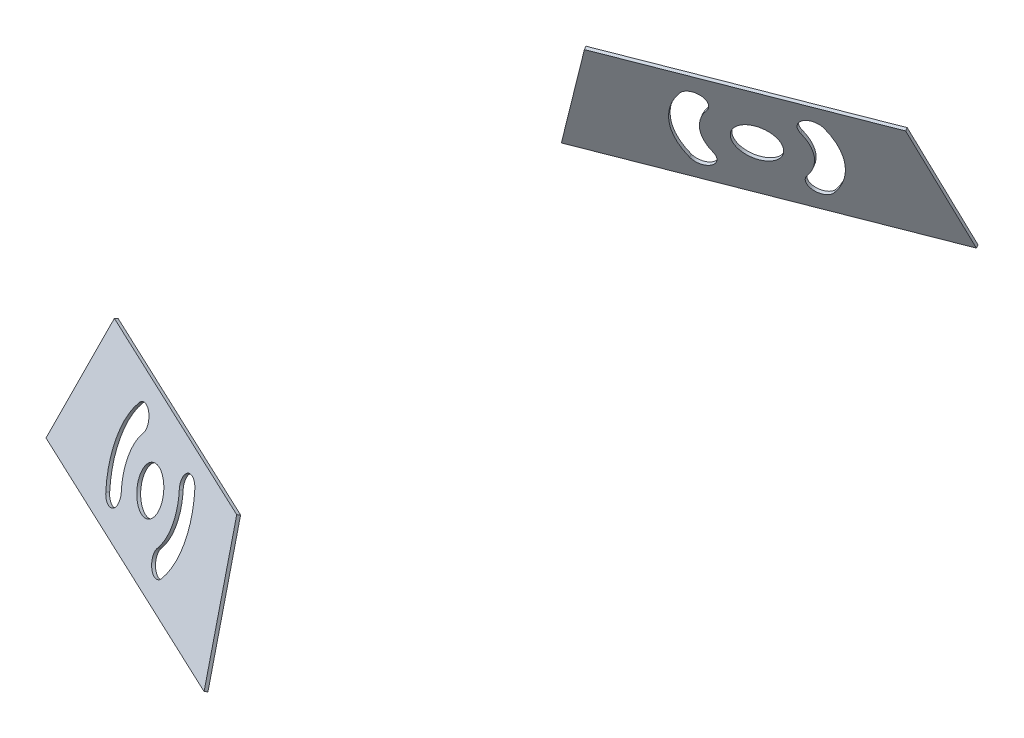
ISO-10303-21;
HEADER;
FILE_DESCRIPTION(('STEP AP214'),'2;1');
FILE_NAME('part.step','',(''),(''),'','','');
FILE_SCHEMA(('AUTOMOTIVE_DESIGN { 1 0 10303 214 1 1 1 1 }'));
ENDSEC;
DATA;
#1=APPLICATION_CONTEXT('core data for automotive mechanical design processes');
#2=APPLICATION_PROTOCOL_DEFINITION('international standard','automotive_design',2000,#1);
#3=PRODUCT_CONTEXT('',#1,'mechanical');
#4=PRODUCT('Part','Part','',(#3));
#5=PRODUCT_RELATED_PRODUCT_CATEGORY('part','',(#4));
#6=PRODUCT_DEFINITION_FORMATION('','',#4);
#7=PRODUCT_DEFINITION_CONTEXT('part definition',#1,'design');
#8=PRODUCT_DEFINITION('design','',#6,#7);
#9=PRODUCT_DEFINITION_SHAPE('','',#8);
#10=(LENGTH_UNIT() NAMED_UNIT(*) SI_UNIT(.MILLI.,.METRE.));
#11=(NAMED_UNIT(*) PLANE_ANGLE_UNIT() SI_UNIT($,.RADIAN.));
#12=(NAMED_UNIT(*) SI_UNIT($,.STERADIAN.) SOLID_ANGLE_UNIT());
#13=UNCERTAINTY_MEASURE_WITH_UNIT(LENGTH_MEASURE(1.E-05),#10,'distance_accuracy_value','');
#14=(GEOMETRIC_REPRESENTATION_CONTEXT(3) GLOBAL_UNCERTAINTY_ASSIGNED_CONTEXT((#13)) GLOBAL_UNIT_ASSIGNED_CONTEXT((#10,
#11,#12)) REPRESENTATION_CONTEXT('',''));
#15=CARTESIAN_POINT('',(0.,0.,0.));
#16=DIRECTION('',(0.,0.,1.));
#17=DIRECTION('',(1.,0.,0.));
#18=AXIS2_PLACEMENT_3D('',#15,#16,#17);
#19=CARTESIAN_POINT('',(-100.488337980226,792.240755520623,249.167094537771));
#20=DIRECTION('',(0.914828301064966,0.27717018179206,0.293710520574162));
#21=DIRECTION('',(-0.30568708311749,0.,0.95213203244882));
#22=AXIS2_PLACEMENT_3D('',#19,#20,#21);
#23=PLANE('',#22);
#24=DIRECTION('',(-0.14672213102117,0.905707057420315,-0.397702580338172));
#25=VECTOR('',#24,1.);
#26=CARTESIAN_POINT('',(-99.7358440045978,791.599284035787,247.42862764111));
#27=LINE('',#26,#25);
#28=CARTESIAN_POINT('',(-99.7358440045978,791.599284035787,247.42862764111));
#29=VERTEX_POINT('',#28);
#30=CARTESIAN_POINT('',(-112.02246548364,867.443873450963,214.124714783217));
#31=VERTEX_POINT('',#30);
#32=EDGE_CURVE('E209',#29,#31,#27,.T.);
#33=ORIENTED_EDGE('',*,*,#32,.T.);
#34=DIRECTION('',(0.376246987814116,-0.320735742417944,-0.869233448330433));
#35=VECTOR('',#34,1.);
#36=CARTESIAN_POINT('',(-112.774959459268,868.085344935799,215.863181679878));
#37=LINE('',#36,#35);
#38=CARTESIAN_POINT('',(-112.774959459268,868.085344935799,215.863181679878));
#39=VERTEX_POINT('',#38);
#40=EDGE_CURVE('E227',#39,#31,#37,.T.);
#41=ORIENTED_EDGE('',*,*,#40,.F.);
#42=DIRECTION('',(-0.14672213102117,0.905707057420315,-0.397702580338172));
#43=VECTOR('',#42,1.);
#44=CARTESIAN_POINT('',(-100.488337980226,792.240755520623,249.167094537771));
#45=LINE('',#44,#43);
#46=CARTESIAN_POINT('',(-100.488337980226,792.240755520623,249.167094537771));
#47=VERTEX_POINT('',#46);
#48=EDGE_CURVE('E213',#47,#39,#45,.T.);
#49=ORIENTED_EDGE('',*,*,#48,.F.);
#50=DIRECTION('',(0.376246987814116,-0.320735742417944,-0.869233448330433));
#51=VECTOR('',#50,1.);
#52=CARTESIAN_POINT('',(-100.488337980226,792.240755520623,249.167094537771));
#53=LINE('',#52,#51);
#54=EDGE_CURVE('E239',#47,#29,#53,.T.);
#55=ORIENTED_EDGE('',*,*,#54,.T.);
#56=EDGE_LOOP('',(#33,#41,#49,#55));
#57=FACE_BOUND('',#56,.T.);
#58=ADVANCED_FACE('F48',(#57),#23,.T.);
#59=CARTESIAN_POINT('',(-285.026253943677,800.018088417502,166.420274569434));
#60=DIRECTION('',(-0.164534605967378,-0.94638888204511,0.27798641582021));
#61=DIRECTION('',(0.,0.281827353128359,0.959465133826479));
#62=AXIS2_PLACEMENT_3D('',#59,#60,#61);
#63=PLANE('',#62);
#64=DIRECTION('',(0.911793050861852,-0.0384274313091164,0.408848095168632));
#65=VECTOR('',#64,1.);
#66=CARTESIAN_POINT('',(-284.273759968049,799.376616932666,164.681807672773));
#67=LINE('',#66,#65);
#68=CARTESIAN_POINT('',(-284.273759968049,799.376616932666,164.681807672773));
#69=VERTEX_POINT('',#68);
#70=EDGE_CURVE('E218',#69,#29,#67,.T.);
#71=ORIENTED_EDGE('',*,*,#70,.T.);
#72=ORIENTED_EDGE('',*,*,#54,.F.);
#73=DIRECTION('',(0.911793050861852,-0.0384274313091164,0.408848095168632));
#74=VECTOR('',#73,1.);
#75=CARTESIAN_POINT('',(-285.026253943677,800.018088417502,166.420274569434));
#76=LINE('',#75,#74);
#77=CARTESIAN_POINT('',(-285.026253943677,800.018088417502,166.420274569434));
#78=VERTEX_POINT('',#77);
#79=EDGE_CURVE('E224',#78,#47,#76,.T.);
#80=ORIENTED_EDGE('',*,*,#79,.F.);
#81=DIRECTION('',(0.376246987814116,-0.320735742417944,-0.869233448330433));
#82=VECTOR('',#81,1.);
#83=CARTESIAN_POINT('',(-285.026253943677,800.018088417502,166.420274569434));
#84=LINE('',#83,#82);
#85=EDGE_CURVE('E244',#78,#69,#84,.T.);
#86=ORIENTED_EDGE('',*,*,#85,.T.);
#87=EDGE_LOOP('',(#71,#72,#80,#86));
#88=FACE_BOUND('',#87,.T.);
#89=ADVANCED_FACE('F297',(#88),#63,.T.);
#90=CARTESIAN_POINT('',(-255.598601468505,874.104633728837,151.821046323257));
#91=DIRECTION('',(-0.852401095250554,0.247851463681334,-0.460415057059038));
#92=DIRECTION('',(0.475243586056191,0.,-0.879854268565228));
#93=AXIS2_PLACEMENT_3D('',#90,#91,#92);
#94=PLANE('',#93);
#95=DIRECTION('',(-0.363112347595701,-0.914165321748003,0.180142131487634));
#96=VECTOR('',#95,1.);
#97=CARTESIAN_POINT('',(-254.846107492877,873.463162244002,150.082579426596));
#98=LINE('',#97,#96);
#99=CARTESIAN_POINT('',(-254.846107492877,873.463162244002,150.082579426596));
#100=VERTEX_POINT('',#99);
#101=EDGE_CURVE('E234',#100,#69,#98,.T.);
#102=ORIENTED_EDGE('',*,*,#101,.T.);
#103=ORIENTED_EDGE('',*,*,#85,.F.);
#104=DIRECTION('',(-0.363112347595701,-0.914165321748003,0.180142131487634));
#105=VECTOR('',#104,1.);
#106=CARTESIAN_POINT('',(-255.598601468505,874.104633728837,151.821046323257));
#107=LINE('',#106,#105);
#108=CARTESIAN_POINT('',(-255.598601468505,874.104633728837,151.821046323257));
#109=VERTEX_POINT('',#108);
#110=EDGE_CURVE('E221',#109,#78,#107,.T.);
#111=ORIENTED_EDGE('',*,*,#110,.F.);
#112=DIRECTION('',(0.376246987814116,-0.320735742417944,-0.869233448330433));
#113=VECTOR('',#112,1.);
#114=CARTESIAN_POINT('',(-255.598601468505,874.104633728837,151.821046323257));
#115=LINE('',#114,#113);
#116=EDGE_CURVE('E248',#109,#100,#115,.T.);
#117=ORIENTED_EDGE('',*,*,#116,.T.);
#118=EDGE_LOOP('',(#102,#103,#111,#117));
#119=FACE_BOUND('',#118,.T.);
#120=ADVANCED_FACE('F302',(#119),#94,.T.);
#121=CARTESIAN_POINT('',(-112.774959459268,868.085344935799,215.863181679878));
#122=DIRECTION('',(0.164534605967344,0.946388882045112,-0.277986415820225));
#123=DIRECTION('',(0.,-0.281827353128373,-0.959465133826475));
#124=AXIS2_PLACEMENT_3D('',#121,#122,#123);
#125=PLANE('',#124);
#126=DIRECTION('',(-0.911793050861858,0.0384274313090818,-0.408848095168622));
#127=VECTOR('',#126,1.);
#128=CARTESIAN_POINT('',(-112.02246548364,867.443873450963,214.124714783217));
#129=LINE('',#128,#127);
#130=EDGE_CURVE('E231',#31,#100,#129,.T.);
#131=ORIENTED_EDGE('',*,*,#130,.T.);
#132=ORIENTED_EDGE('',*,*,#116,.F.);
#133=DIRECTION('',(-0.911793050861858,0.0384274313090818,-0.408848095168622));
#134=VECTOR('',#133,1.);
#135=CARTESIAN_POINT('',(-112.774959459268,868.085344935799,215.863181679878));
#136=LINE('',#135,#134);
#137=EDGE_CURVE('E217',#39,#109,#136,.T.);
#138=ORIENTED_EDGE('',*,*,#137,.F.);
#139=ORIENTED_EDGE('',*,*,#40,.T.);
#140=EDGE_LOOP('',(#131,#132,#138,#139));
#141=FACE_BOUND('',#140,.T.);
#142=ADVANCED_FACE('F314',(#141),#125,.T.);
#143=CARTESIAN_POINT('',(-191.318859555588,163.09179460709,441.998892770698));
#144=DIRECTION('',(0.376246987814115,-0.320735742417945,-0.869233448330432));
#145=DIRECTION('',(0.917717646573411,0.,0.397233333404637));
#146=AXIS2_PLACEMENT_3D('',#143,#144,#145);
#147=PLANE('',#146);
#148=CARTESIAN_POINT('',(-188.472038212911,833.612205650694,195.817899277588));
#149=DIRECTION('',(0.376246987814116,-0.320735742417944,-0.869233448330433));
#150=DIRECTION('',(-0.917717646573411,0.,-0.397233333404637));
#151=AXIS2_PLACEMENT_3D('',#148,#149,#150);
#152=CIRCLE('',#151,42.9999999999843);
#153=CARTESIAN_POINT('',(-152.502164163958,856.013638420316,203.121594970125));
#154=VERTEX_POINT('',#153);
#155=CARTESIAN_POINT('',(-160.073134703262,809.311043668525,217.077151516664));
#156=VERTEX_POINT('',#155);
#157=EDGE_CURVE('E143',#154,#156,#152,.T.);
#158=ORIENTED_EDGE('',*,*,#157,.T.);
#159=CARTESIAN_POINT('',(-165.02643182704,813.549618432857,213.369142405197));
#160=DIRECTION('',(0.376246987814116,-0.320735742417944,-0.869233448330433));
#161=DIRECTION('',(-0.917717646573411,0.,-0.397233333404637));
#162=AXIS2_PLACEMENT_3D('',#159,#160,#161);
#163=CIRCLE('',#162,7.50000000000004);
#164=CARTESIAN_POINT('',(-169.979728950819,817.788193197189,209.661133293729));
#165=VERTEX_POINT('',#164);
#166=EDGE_CURVE('E153',#156,#165,#163,.T.);
#167=ORIENTED_EDGE('',*,*,#166,.T.);
#168=CARTESIAN_POINT('',(-188.472038212911,833.612205650694,195.817899277588));
#169=DIRECTION('',(-0.376246987814116,0.320735742417944,0.869233448330433));
#170=DIRECTION('',(-0.917717646573411,0.,-0.397233333404637));
#171=AXIS2_PLACEMENT_3D('',#168,#169,#170);
#172=CIRCLE('',#171,27.9999999999841);
#173=CARTESIAN_POINT('',(-165.049794646156,848.199185128585,200.573794147147));
#174=VERTEX_POINT('',#173);
#175=EDGE_CURVE('E159',#165,#174,#172,.T.);
#176=ORIENTED_EDGE('',*,*,#175,.T.);
#177=CARTESIAN_POINT('',(-158.775979405059,852.10641177445,201.847694558636));
#178=DIRECTION('',(0.376246987814116,-0.320735742417944,-0.869233448330433));
#179=DIRECTION('',(-0.917717646573411,0.,-0.397233333404637));
#180=AXIS2_PLACEMENT_3D('',#177,#178,#179);
#181=CIRCLE('',#180,7.5000000000001);
#182=EDGE_CURVE('E163',#174,#154,#181,.T.);
#183=ORIENTED_EDGE('',*,*,#182,.T.);
#184=EDGE_LOOP('',(#158,#167,#176,#183));
#185=FACE_BOUND('',#184,.T.);
#186=CARTESIAN_POINT('',(-188.472038212911,833.612205650694,195.817899277588));
#187=DIRECTION('',(0.376246987814116,-0.320735742417944,-0.869233448330433));
#188=DIRECTION('',(-0.917717646573411,0.,-0.397233333404637));
#189=AXIS2_PLACEMENT_3D('',#186,#187,#188);
#190=CIRCLE('',#189,42.9999999999991);
#191=CARTESIAN_POINT('',(-224.441912261877,811.210772881066,188.514203585045));
#192=VERTEX_POINT('',#191);
#193=CARTESIAN_POINT('',(-216.870941722575,857.913367632866,174.558647038504));
#194=VERTEX_POINT('',#193);
#195=EDGE_CURVE('E185',#192,#194,#190,.T.);
#196=ORIENTED_EDGE('',*,*,#195,.T.);
#197=CARTESIAN_POINT('',(-211.917644598797,853.674792868535,178.266656149972));
#198=DIRECTION('',(0.376246987814116,-0.320735742417944,-0.869233448330433));
#199=DIRECTION('',(-0.917717646573411,0.,-0.397233333404637));
#200=AXIS2_PLACEMENT_3D('',#197,#198,#199);
#201=CIRCLE('',#200,7.49999999999986);
#202=CARTESIAN_POINT('',(-206.964347475019,849.436218104202,181.97466526144));
#203=VERTEX_POINT('',#202);
#204=EDGE_CURVE('E189',#194,#203,#201,.T.);
#205=ORIENTED_EDGE('',*,*,#204,.T.);
#206=CARTESIAN_POINT('',(-188.472038212911,833.612205650694,195.817899277588));
#207=DIRECTION('',(-0.376246987814116,0.320735742417944,0.869233448330433));
#208=DIRECTION('',(-0.917717646573411,0.,-0.397233333404637));
#209=AXIS2_PLACEMENT_3D('',#206,#207,#208);
#210=CIRCLE('',#209,27.9999999999994);
#211=CARTESIAN_POINT('',(-211.894281779681,819.025226172798,191.062004408025));
#212=VERTEX_POINT('',#211);
#213=EDGE_CURVE('E192',#203,#212,#210,.T.);
#214=ORIENTED_EDGE('',*,*,#213,.T.);
#215=CARTESIAN_POINT('',(-218.16809702078,815.117999526931,189.788103996536));
#216=DIRECTION('',(0.376246987814116,-0.320735742417944,-0.869233448330433));
#217=DIRECTION('',(-0.917717646573411,0.,-0.397233333404637));
#218=AXIS2_PLACEMENT_3D('',#215,#216,#217);
#219=CIRCLE('',#218,7.4999999999999);
#220=EDGE_CURVE('E182',#212,#192,#219,.T.);
#221=ORIENTED_EDGE('',*,*,#220,.T.);
#222=EDGE_LOOP('',(#196,#205,#214,#221));
#223=FACE_BOUND('',#222,.T.);
#224=CARTESIAN_POINT('',(-188.472038212919,833.612205650692,195.817899277584));
#225=DIRECTION('',(-0.376246987814116,0.320735742417944,0.869233448330433));
#226=DIRECTION('',(0.917717646573411,0.,0.397233333404637));
#227=AXIS2_PLACEMENT_3D('',#224,#225,#226);
#228=CIRCLE('',#227,12.9999999999907);
#229=CARTESIAN_POINT('',(-176.541708807473,833.612205650692,200.981932611841));
#230=VERTEX_POINT('',#229);
#231=EDGE_CURVE('E206',#230,#230,#228,.T.);
#232=ORIENTED_EDGE('',*,*,#231,.F.);
#233=EDGE_LOOP('',(#232));
#234=FACE_BOUND('',#233,.T.);
#235=ORIENTED_EDGE('',*,*,#48,.T.);
#236=ORIENTED_EDGE('',*,*,#137,.T.);
#237=ORIENTED_EDGE('',*,*,#110,.T.);
#238=ORIENTED_EDGE('',*,*,#79,.T.);
#239=EDGE_LOOP('',(#235,#236,#237,#238));
#240=FACE_BOUND('',#239,.T.);
#241=ADVANCED_FACE('F161',(#185,#223,#234,#240),#147,.F.);
#242=CARTESIAN_POINT('',(-190.56636557996,162.450323122254,440.260425874037));
#243=DIRECTION('',(0.376246987814115,-0.320735742417945,-0.869233448330432));
#244=DIRECTION('',(0.917717646573411,0.,0.397233333404637));
#245=AXIS2_PLACEMENT_3D('',#242,#243,#244);
#246=PLANE('',#245);
#247=CARTESIAN_POINT('',(-158.02348542943,851.464940289614,200.109227661974));
#248=DIRECTION('',(-0.376246987814115,0.320735742417945,0.869233448330432));
#249=DIRECTION('',(0.917717646573411,0.,0.397233333404637));
#250=AXIS2_PLACEMENT_3D('',#247,#248,#249);
#251=CIRCLE('',#250,7.5000000000001);
#252=CARTESIAN_POINT('',(-151.74967018833,855.37216693548,201.383128073465));
#253=VERTEX_POINT('',#252);
#254=CARTESIAN_POINT('',(-164.297300670527,847.557713643749,198.835327250485));
#255=VERTEX_POINT('',#254);
#256=EDGE_CURVE('E12',#253,#255,#251,.T.);
#257=ORIENTED_EDGE('',*,*,#256,.T.);
#258=CARTESIAN_POINT('',(-187.719544237283,832.970734165858,194.079432380926));
#259=DIRECTION('',(-0.376246987814115,0.320735742417945,0.869233448330432));
#260=DIRECTION('',(0.917717646573411,0.,0.397233333404637));
#261=AXIS2_PLACEMENT_3D('',#258,#259,#260);
#262=CIRCLE('',#261,27.9999999999841);
#263=CARTESIAN_POINT('',(-169.22723497519,817.146721712353,207.922666397067));
#264=VERTEX_POINT('',#263);
#265=EDGE_CURVE('E56',#255,#264,#262,.F.);
#266=ORIENTED_EDGE('',*,*,#265,.T.);
#267=CARTESIAN_POINT('',(-164.273937851411,812.908146948021,211.630675508535));
#268=DIRECTION('',(-0.376246987814115,0.320735742417945,0.869233448330432));
#269=DIRECTION('',(0.917717646573411,0.,0.397233333404637));
#270=AXIS2_PLACEMENT_3D('',#267,#268,#269);
#271=CIRCLE('',#270,7.50000000000004);
#272=CARTESIAN_POINT('',(-159.320640727634,808.669572183689,215.338684620002));
#273=VERTEX_POINT('',#272);
#274=EDGE_CURVE('E272',#264,#273,#271,.T.);
#275=ORIENTED_EDGE('',*,*,#274,.T.);
#276=CARTESIAN_POINT('',(-187.719544237283,832.970734165858,194.079432380926));
#277=DIRECTION('',(-0.376246987814115,0.320735742417945,0.869233448330432));
#278=DIRECTION('',(0.917717646573411,0.,0.397233333404637));
#279=AXIS2_PLACEMENT_3D('',#276,#277,#278);
#280=CIRCLE('',#279,42.9999999999843);
#281=EDGE_CURVE('E145',#273,#253,#280,.T.);
#282=ORIENTED_EDGE('',*,*,#281,.T.);
#283=EDGE_LOOP('',(#257,#266,#275,#282));
#284=FACE_BOUND('',#283,.T.);
#285=CARTESIAN_POINT('',(-217.415603045151,814.476528042095,188.049637099874));
#286=DIRECTION('',(-0.376246987814115,0.320735742417945,0.869233448330432));
#287=DIRECTION('',(0.917717646573411,0.,0.397233333404637));
#288=AXIS2_PLACEMENT_3D('',#285,#286,#287);
#289=CIRCLE('',#288,7.4999999999999);
#290=CARTESIAN_POINT('',(-223.689418286249,810.56930139623,186.775736688384));
#291=VERTEX_POINT('',#290);
#292=CARTESIAN_POINT('',(-211.141787804052,818.383754687962,189.323537511363));
#293=VERTEX_POINT('',#292);
#294=EDGE_CURVE('E266',#291,#293,#289,.T.);
#295=ORIENTED_EDGE('',*,*,#294,.T.);
#296=CARTESIAN_POINT('',(-187.719544237283,832.970734165858,194.079432380926));
#297=DIRECTION('',(-0.376246987814115,0.320735742417945,0.869233448330432));
#298=DIRECTION('',(0.917717646573411,0.,0.397233333404637));
#299=AXIS2_PLACEMENT_3D('',#296,#297,#298);
#300=CIRCLE('',#299,27.9999999999994);
#301=CARTESIAN_POINT('',(-206.21185349939,848.794746619366,180.236198364778));
#302=VERTEX_POINT('',#301);
#303=EDGE_CURVE('E262',#293,#302,#300,.F.);
#304=ORIENTED_EDGE('',*,*,#303,.T.);
#305=CARTESIAN_POINT('',(-211.165150623169,853.033321383698,176.52818925331));
#306=DIRECTION('',(-0.376246987814115,0.320735742417945,0.869233448330432));
#307=DIRECTION('',(0.917717646573411,0.,0.397233333404637));
#308=AXIS2_PLACEMENT_3D('',#305,#306,#307);
#309=CIRCLE('',#308,7.49999999999986);
#310=CARTESIAN_POINT('',(-216.118447746946,857.27189614803,172.820180141842));
#311=VERTEX_POINT('',#310);
#312=EDGE_CURVE('E258',#302,#311,#309,.T.);
#313=ORIENTED_EDGE('',*,*,#312,.T.);
#314=CARTESIAN_POINT('',(-187.719544237283,832.970734165858,194.079432380926));
#315=DIRECTION('',(-0.376246987814115,0.320735742417945,0.869233448330432));
#316=DIRECTION('',(0.917717646573411,0.,0.397233333404637));
#317=AXIS2_PLACEMENT_3D('',#314,#315,#316);
#318=CIRCLE('',#317,42.9999999999991);
#319=EDGE_CURVE('E243',#311,#291,#318,.T.);
#320=ORIENTED_EDGE('',*,*,#319,.T.);
#321=EDGE_LOOP('',(#295,#304,#313,#320));
#322=FACE_BOUND('',#321,.T.);
#323=CARTESIAN_POINT('',(-187.71954423729,832.970734165856,194.079432380924));
#324=DIRECTION('',(-0.376246987814116,0.320735742417944,0.869233448330433));
#325=DIRECTION('',(0.917717646573411,0.,0.397233333404637));
#326=AXIS2_PLACEMENT_3D('',#323,#324,#325);
#327=CIRCLE('',#326,12.9999999999907);
#328=CARTESIAN_POINT('',(-175.789214831845,832.970734165856,199.24346571518));
#329=VERTEX_POINT('',#328);
#330=EDGE_CURVE('E177',#329,#329,#327,.T.);
#331=ORIENTED_EDGE('',*,*,#330,.T.);
#332=EDGE_LOOP('',(#331));
#333=FACE_BOUND('',#332,.T.);
#334=ORIENTED_EDGE('',*,*,#32,.F.);
#335=ORIENTED_EDGE('',*,*,#70,.F.);
#336=ORIENTED_EDGE('',*,*,#101,.F.);
#337=ORIENTED_EDGE('',*,*,#130,.F.);
#338=EDGE_LOOP('',(#334,#335,#336,#337));
#339=FACE_BOUND('',#338,.T.);
#340=ADVANCED_FACE('F278',(#284,#322,#333,#339),#246,.T.);
#341=CARTESIAN_POINT('',(-188.472038212919,833.612205650692,195.817899277584));
#342=DIRECTION('',(0.376246987814116,-0.320735742417944,-0.869233448330433));
#343=DIRECTION('',(0.917717646573411,0.,0.397233333404637));
#344=AXIS2_PLACEMENT_3D('',#341,#342,#343);
#345=CYLINDRICAL_SURFACE('',#344,12.9999999999907);
#346=ORIENTED_EDGE('',*,*,#231,.T.);
#347=EDGE_LOOP('',(#346));
#348=FACE_BOUND('',#347,.T.);
#349=ORIENTED_EDGE('',*,*,#330,.F.);
#350=EDGE_LOOP('',(#349));
#351=FACE_BOUND('',#350,.T.);
#352=ADVANCED_FACE('F328',(#348,#351),#345,.F.);
#353=CARTESIAN_POINT('',(-214.405627142638,811.910642102752,181.095769513231));
#354=DIRECTION('',(-0.376246987814116,0.320735742417944,0.869233448330433));
#355=DIRECTION('',(-0.917717646573411,0.,-0.397233333404637));
#356=AXIS2_PLACEMENT_3D('',#353,#354,#355);
#357=CYLINDRICAL_SURFACE('',#356,7.4999999999999);
#358=ORIENTED_EDGE('',*,*,#294,.F.);
#359=DIRECTION('',(-0.376246987814116,0.320735742417944,0.869233448330433));
#360=VECTOR('',#359,1.);
#361=CARTESIAN_POINT('',(-220.679442383737,808.003415456887,179.821869101741));
#362=LINE('',#361,#360);
#363=EDGE_CURVE('E71',#291,#192,#362,.T.);
#364=ORIENTED_EDGE('',*,*,#363,.T.);
#365=ORIENTED_EDGE('',*,*,#220,.F.);
#366=DIRECTION('',(-0.376246987814116,0.320735742417944,0.869233448330433));
#367=VECTOR('',#366,1.);
#368=CARTESIAN_POINT('',(-208.131811901539,815.817868748618,182.369669924721));
#369=LINE('',#368,#367);
#370=EDGE_CURVE('E169',#293,#212,#369,.T.);
#371=ORIENTED_EDGE('',*,*,#370,.F.);
#372=EDGE_LOOP('',(#358,#364,#365,#371));
#373=FACE_BOUND('',#372,.T.);
#374=ADVANCED_FACE('F333',(#373),#357,.F.);
#375=CARTESIAN_POINT('',(-184.70956833477,830.404848226515,187.125564794284));
#376=DIRECTION('',(-0.376246987814116,0.320735742417944,0.869233448330433));
#377=DIRECTION('',(-0.917717646573411,0.,-0.397233333404637));
#378=AXIS2_PLACEMENT_3D('',#375,#376,#377);
#379=CYLINDRICAL_SURFACE('',#378,27.9999999999994);
#380=ORIENTED_EDGE('',*,*,#303,.F.);
#381=ORIENTED_EDGE('',*,*,#370,.T.);
#382=ORIENTED_EDGE('',*,*,#213,.F.);
#383=DIRECTION('',(-0.376246987814116,0.320735742417944,0.869233448330433));
#384=VECTOR('',#383,1.);
#385=CARTESIAN_POINT('',(-203.201877596878,846.228860680023,173.282330778135));
#386=LINE('',#385,#384);
#387=EDGE_CURVE('E198',#302,#203,#386,.T.);
#388=ORIENTED_EDGE('',*,*,#387,.F.);
#389=EDGE_LOOP('',(#380,#381,#382,#388));
#390=FACE_BOUND('',#389,.T.);
#391=ADVANCED_FACE('F336',(#390),#379,.T.);
#392=CARTESIAN_POINT('',(-208.155174720656,850.467435444355,169.574321666667));
#393=DIRECTION('',(-0.376246987814116,0.320735742417944,0.869233448330433));
#394=DIRECTION('',(-0.917717646573411,0.,-0.397233333404637));
#395=AXIS2_PLACEMENT_3D('',#392,#393,#394);
#396=CYLINDRICAL_SURFACE('',#395,7.49999999999986);
#397=ORIENTED_EDGE('',*,*,#312,.F.);
#398=ORIENTED_EDGE('',*,*,#387,.T.);
#399=ORIENTED_EDGE('',*,*,#204,.F.);
#400=DIRECTION('',(-0.376246987814116,0.320735742417944,0.869233448330433));
#401=VECTOR('',#400,1.);
#402=CARTESIAN_POINT('',(-213.108471844434,854.706010208687,165.8663125552));
#403=LINE('',#402,#401);
#404=EDGE_CURVE('E201',#311,#194,#403,.T.);
#405=ORIENTED_EDGE('',*,*,#404,.F.);
#406=EDGE_LOOP('',(#397,#398,#399,#405));
#407=FACE_BOUND('',#406,.T.);
#408=ADVANCED_FACE('F291',(#407),#396,.F.);
#409=CARTESIAN_POINT('',(-184.70956833477,830.404848226515,187.125564794284));
#410=DIRECTION('',(-0.376246987814116,0.320735742417944,0.869233448330433));
#411=DIRECTION('',(-0.917717646573411,0.,-0.397233333404637));
#412=AXIS2_PLACEMENT_3D('',#409,#410,#411);
#413=CYLINDRICAL_SURFACE('',#412,42.9999999999991);
#414=ORIENTED_EDGE('',*,*,#319,.F.);
#415=ORIENTED_EDGE('',*,*,#404,.T.);
#416=ORIENTED_EDGE('',*,*,#195,.F.);
#417=ORIENTED_EDGE('',*,*,#363,.F.);
#418=EDGE_LOOP('',(#414,#415,#416,#417));
#419=FACE_BOUND('',#418,.T.);
#420=ADVANCED_FACE('F284',(#419),#413,.F.);
#421=CARTESIAN_POINT('',(-155.013509526917,848.89905435027,193.155360075332));
#422=DIRECTION('',(-0.376246987814116,0.320735742417944,0.869233448330433));
#423=DIRECTION('',(-0.917717646573411,0.,-0.397233333404637));
#424=AXIS2_PLACEMENT_3D('',#421,#422,#423);
#425=CYLINDRICAL_SURFACE('',#424,7.5000000000001);
#426=ORIENTED_EDGE('',*,*,#256,.F.);
#427=DIRECTION('',(-0.376246987814116,0.320735742417944,0.869233448330433));
#428=VECTOR('',#427,1.);
#429=CARTESIAN_POINT('',(-148.739694285817,852.806280996137,194.429260486822));
#430=LINE('',#429,#428);
#431=EDGE_CURVE('E63',#253,#154,#430,.T.);
#432=ORIENTED_EDGE('',*,*,#431,.T.);
#433=ORIENTED_EDGE('',*,*,#182,.F.);
#434=DIRECTION('',(-0.376246987814116,0.320735742417944,0.869233448330433));
#435=VECTOR('',#434,1.);
#436=CARTESIAN_POINT('',(-161.287324768015,844.991827704406,191.881459663842));
#437=LINE('',#436,#435);
#438=EDGE_CURVE('E174',#255,#174,#437,.T.);
#439=ORIENTED_EDGE('',*,*,#438,.F.);
#440=EDGE_LOOP('',(#426,#432,#433,#439));
#441=FACE_BOUND('',#440,.T.);
#442=ADVANCED_FACE('F282',(#441),#425,.F.);
#443=CARTESIAN_POINT('',(-184.70956833477,830.404848226515,187.125564794284));
#444=DIRECTION('',(-0.376246987814116,0.320735742417944,0.869233448330433));
#445=DIRECTION('',(-0.917717646573411,0.,-0.397233333404637));
#446=AXIS2_PLACEMENT_3D('',#443,#444,#445);
#447=CYLINDRICAL_SURFACE('',#446,27.9999999999841);
#448=ORIENTED_EDGE('',*,*,#265,.F.);
#449=ORIENTED_EDGE('',*,*,#438,.T.);
#450=ORIENTED_EDGE('',*,*,#175,.F.);
#451=DIRECTION('',(-0.376246987814116,0.320735742417944,0.869233448330433));
#452=VECTOR('',#451,1.);
#453=CARTESIAN_POINT('',(-166.217259072677,814.58083577301,200.968798810424));
#454=LINE('',#453,#452);
#455=EDGE_CURVE('E150',#264,#165,#454,.T.);
#456=ORIENTED_EDGE('',*,*,#455,.F.);
#457=EDGE_LOOP('',(#448,#449,#450,#456));
#458=FACE_BOUND('',#457,.T.);
#459=ADVANCED_FACE('F281',(#458),#447,.T.);
#460=CARTESIAN_POINT('',(-161.263961948899,810.342261008677,204.676807921892));
#461=DIRECTION('',(-0.376246987814116,0.320735742417944,0.869233448330433));
#462=DIRECTION('',(-0.917717646573411,0.,-0.397233333404637));
#463=AXIS2_PLACEMENT_3D('',#460,#461,#462);
#464=CYLINDRICAL_SURFACE('',#463,7.50000000000004);
#465=ORIENTED_EDGE('',*,*,#274,.F.);
#466=ORIENTED_EDGE('',*,*,#455,.T.);
#467=ORIENTED_EDGE('',*,*,#166,.F.);
#468=DIRECTION('',(-0.376246987814116,0.320735742417944,0.869233448330433));
#469=VECTOR('',#468,1.);
#470=CARTESIAN_POINT('',(-156.310664825121,806.103686244346,208.38481703336));
#471=LINE('',#470,#469);
#472=EDGE_CURVE('E139',#273,#156,#471,.T.);
#473=ORIENTED_EDGE('',*,*,#472,.F.);
#474=EDGE_LOOP('',(#465,#466,#467,#473));
#475=FACE_BOUND('',#474,.T.);
#476=ADVANCED_FACE('F154',(#475),#464,.F.);
#477=CARTESIAN_POINT('',(-184.70956833477,830.404848226515,187.125564794284));
#478=DIRECTION('',(-0.376246987814116,0.320735742417944,0.869233448330433));
#479=DIRECTION('',(-0.917717646573411,0.,-0.397233333404637));
#480=AXIS2_PLACEMENT_3D('',#477,#478,#479);
#481=CYLINDRICAL_SURFACE('',#480,42.9999999999843);
#482=ORIENTED_EDGE('',*,*,#281,.F.);
#483=ORIENTED_EDGE('',*,*,#472,.T.);
#484=ORIENTED_EDGE('',*,*,#157,.F.);
#485=ORIENTED_EDGE('',*,*,#431,.F.);
#486=EDGE_LOOP('',(#482,#483,#484,#485));
#487=FACE_BOUND('',#486,.T.);
#488=ADVANCED_FACE('F141',(#487),#481,.F.);
#489=CLOSED_SHELL('',(#58,#89,#120,#142,#241,#340,#352,#374,#391,#408,#420,#442,#459,#476,#488));
#490=MANIFOLD_SOLID_BREP('B2',#489);
#491=CARTESIAN_POINT('',(-100.488337980226,792.240755520623,-249.167094537771));
#492=DIRECTION('',(0.914828301064966,0.27717018179206,-0.293710520574162));
#493=DIRECTION('',(-0.30568708311749,0.,-0.95213203244882));
#494=AXIS2_PLACEMENT_3D('',#491,#492,#493);
#495=PLANE('',#494);
#496=DIRECTION('',(-0.14672213102117,0.905707057420315,0.397702580338172));
#497=VECTOR('',#496,1.);
#498=CARTESIAN_POINT('',(-99.7358440045978,791.599284035787,-247.42862764111));
#499=LINE('',#498,#497);
#500=CARTESIAN_POINT('',(-99.7358440045978,791.599284035787,-247.42862764111));
#501=VERTEX_POINT('',#500);
#502=CARTESIAN_POINT('',(-112.02246548364,867.443873450963,-214.124714783217));
#503=VERTEX_POINT('',#502);
#504=EDGE_CURVE('E618',#501,#503,#499,.T.);
#505=ORIENTED_EDGE('',*,*,#504,.F.);
#506=DIRECTION('',(0.376246987814116,-0.320735742417944,0.869233448330433));
#507=VECTOR('',#506,1.);
#508=CARTESIAN_POINT('',(-100.488337980226,792.240755520623,-249.167094537771));
#509=LINE('',#508,#507);
#510=CARTESIAN_POINT('',(-100.488337980226,792.240755520623,-249.167094537771));
#511=VERTEX_POINT('',#510);
#512=EDGE_CURVE('E653',#511,#501,#509,.T.);
#513=ORIENTED_EDGE('',*,*,#512,.F.);
#514=DIRECTION('',(-0.14672213102117,0.905707057420315,0.397702580338172));
#515=VECTOR('',#514,1.);
#516=CARTESIAN_POINT('',(-100.488337980226,792.240755520623,-249.167094537771));
#517=LINE('',#516,#515);
#518=CARTESIAN_POINT('',(-112.774959459268,868.085344935799,-215.863181679878));
#519=VERTEX_POINT('',#518);
#520=EDGE_CURVE('E621',#511,#519,#517,.T.);
#521=ORIENTED_EDGE('',*,*,#520,.T.);
#522=DIRECTION('',(0.376246987814116,-0.320735742417944,0.869233448330433));
#523=VECTOR('',#522,1.);
#524=CARTESIAN_POINT('',(-112.774959459268,868.085344935799,-215.863181679878));
#525=LINE('',#524,#523);
#526=EDGE_CURVE('E638',#519,#503,#525,.T.);
#527=ORIENTED_EDGE('',*,*,#526,.T.);
#528=EDGE_LOOP('',(#505,#513,#521,#527));
#529=FACE_BOUND('',#528,.T.);
#530=ADVANCED_FACE('F457',(#529),#495,.T.);
#531=CARTESIAN_POINT('',(-285.026253943677,800.018088417502,-166.420274569434));
#532=DIRECTION('',(-0.164534605967378,-0.94638888204511,-0.27798641582021));
#533=DIRECTION('',(0.,0.281827353128359,-0.959465133826479));
#534=AXIS2_PLACEMENT_3D('',#531,#532,#533);
#535=PLANE('',#534);
#536=DIRECTION('',(0.911793050861852,-0.0384274313091164,-0.408848095168632));
#537=VECTOR('',#536,1.);
#538=CARTESIAN_POINT('',(-284.273759968049,799.376616932666,-164.681807672773));
#539=LINE('',#538,#537);
#540=CARTESIAN_POINT('',(-284.273759968049,799.376616932666,-164.681807672773));
#541=VERTEX_POINT('',#540);
#542=EDGE_CURVE('E626',#541,#501,#539,.T.);
#543=ORIENTED_EDGE('',*,*,#542,.F.);
#544=DIRECTION('',(0.376246987814116,-0.320735742417944,0.869233448330433));
#545=VECTOR('',#544,1.);
#546=CARTESIAN_POINT('',(-285.026253943677,800.018088417502,-166.420274569434));
#547=LINE('',#546,#545);
#548=CARTESIAN_POINT('',(-285.026253943677,800.018088417502,-166.420274569434));
#549=VERTEX_POINT('',#548);
#550=EDGE_CURVE('E657',#549,#541,#547,.T.);
#551=ORIENTED_EDGE('',*,*,#550,.F.);
#552=DIRECTION('',(0.911793050861852,-0.0384274313091164,-0.408848095168632));
#553=VECTOR('',#552,1.);
#554=CARTESIAN_POINT('',(-285.026253943677,800.018088417502,-166.420274569434));
#555=LINE('',#554,#553);
#556=EDGE_CURVE('E634',#549,#511,#555,.T.);
#557=ORIENTED_EDGE('',*,*,#556,.T.);
#558=ORIENTED_EDGE('',*,*,#512,.T.);
#559=EDGE_LOOP('',(#543,#551,#557,#558));
#560=FACE_BOUND('',#559,.T.);
#561=ADVANCED_FACE('F705',(#560),#535,.T.);
#562=CARTESIAN_POINT('',(-255.598601468505,874.104633728837,-151.821046323257));
#563=DIRECTION('',(-0.852401095250554,0.247851463681334,0.460415057059038));
#564=DIRECTION('',(0.475243586056191,0.,0.879854268565228));
#565=AXIS2_PLACEMENT_3D('',#562,#563,#564);
#566=PLANE('',#565);
#567=DIRECTION('',(-0.363112347595701,-0.914165321748003,-0.180142131487634));
#568=VECTOR('',#567,1.);
#569=CARTESIAN_POINT('',(-254.846107492877,873.463162244002,-150.082579426596));
#570=LINE('',#569,#568);
#571=CARTESIAN_POINT('',(-254.846107492877,873.463162244002,-150.082579426596));
#572=VERTEX_POINT('',#571);
#573=EDGE_CURVE('E646',#572,#541,#570,.T.);
#574=ORIENTED_EDGE('',*,*,#573,.F.);
#575=DIRECTION('',(0.376246987814116,-0.320735742417944,0.869233448330433));
#576=VECTOR('',#575,1.);
#577=CARTESIAN_POINT('',(-255.598601468505,874.104633728837,-151.821046323257));
#578=LINE('',#577,#576);
#579=CARTESIAN_POINT('',(-255.598601468505,874.104633728837,-151.821046323257));
#580=VERTEX_POINT('',#579);
#581=EDGE_CURVE('E660',#580,#572,#578,.T.);
#582=ORIENTED_EDGE('',*,*,#581,.F.);
#583=DIRECTION('',(-0.363112347595701,-0.914165321748003,-0.180142131487634));
#584=VECTOR('',#583,1.);
#585=CARTESIAN_POINT('',(-255.598601468505,874.104633728837,-151.821046323257));
#586=LINE('',#585,#584);
#587=EDGE_CURVE('E630',#580,#549,#586,.T.);
#588=ORIENTED_EDGE('',*,*,#587,.T.);
#589=ORIENTED_EDGE('',*,*,#550,.T.);
#590=EDGE_LOOP('',(#574,#582,#588,#589));
#591=FACE_BOUND('',#590,.T.);
#592=ADVANCED_FACE('F710',(#591),#566,.T.);
#593=CARTESIAN_POINT('',(-112.774959459268,868.085344935799,-215.863181679878));
#594=DIRECTION('',(0.164534605967344,0.946388882045112,0.277986415820225));
#595=DIRECTION('',(0.,-0.281827353128373,0.959465133826475));
#596=AXIS2_PLACEMENT_3D('',#593,#594,#595);
#597=PLANE('',#596);
#598=DIRECTION('',(-0.911793050861858,0.0384274313090818,0.408848095168622));
#599=VECTOR('',#598,1.);
#600=CARTESIAN_POINT('',(-112.02246548364,867.443873450963,-214.124714783217));
#601=LINE('',#600,#599);
#602=EDGE_CURVE('E642',#503,#572,#601,.T.);
#603=ORIENTED_EDGE('',*,*,#602,.F.);
#604=ORIENTED_EDGE('',*,*,#526,.F.);
#605=DIRECTION('',(-0.911793050861858,0.0384274313090818,0.408848095168622));
#606=VECTOR('',#605,1.);
#607=CARTESIAN_POINT('',(-112.774959459268,868.085344935799,-215.863181679878));
#608=LINE('',#607,#606);
#609=EDGE_CURVE('E625',#519,#580,#608,.T.);
#610=ORIENTED_EDGE('',*,*,#609,.T.);
#611=ORIENTED_EDGE('',*,*,#581,.T.);
#612=EDGE_LOOP('',(#603,#604,#610,#611));
#613=FACE_BOUND('',#612,.T.);
#614=ADVANCED_FACE('F724',(#613),#597,.T.);
#615=CARTESIAN_POINT('',(-191.318859555588,163.09179460709,-441.998892770698));
#616=DIRECTION('',(0.376246987814115,-0.320735742417945,0.869233448330432));
#617=DIRECTION('',(0.917717646573411,0.,-0.397233333404637));
#618=AXIS2_PLACEMENT_3D('',#615,#616,#617);
#619=PLANE('',#618);
#620=CARTESIAN_POINT('',(-188.472038212911,833.612205650694,-195.817899277588));
#621=DIRECTION('',(-0.376246987814116,0.320735742417944,-0.869233448330433));
#622=DIRECTION('',(-0.917717646573411,0.,0.397233333404637));
#623=AXIS2_PLACEMENT_3D('',#620,#621,#622);
#624=CIRCLE('',#623,42.9999999999843);
#625=CARTESIAN_POINT('',(-152.502164163958,856.013638420316,-203.121594970125));
#626=VERTEX_POINT('',#625);
#627=CARTESIAN_POINT('',(-160.073134703262,809.311043668525,-217.077151516664));
#628=VERTEX_POINT('',#627);
#629=EDGE_CURVE('E563',#626,#628,#624,.T.);
#630=ORIENTED_EDGE('',*,*,#629,.F.);
#631=CARTESIAN_POINT('',(-158.775979405059,852.10641177445,-201.847694558636));
#632=DIRECTION('',(-0.376246987814116,0.320735742417944,-0.869233448330433));
#633=DIRECTION('',(-0.917717646573411,0.,0.397233333404637));
#634=AXIS2_PLACEMENT_3D('',#631,#632,#633);
#635=CIRCLE('',#634,7.5000000000001);
#636=CARTESIAN_POINT('',(-165.049794646156,848.199185128585,-200.573794147147));
#637=VERTEX_POINT('',#636);
#638=EDGE_CURVE('E472',#637,#626,#635,.T.);
#639=ORIENTED_EDGE('',*,*,#638,.F.);
#640=CARTESIAN_POINT('',(-188.472038212911,833.612205650694,-195.817899277588));
#641=DIRECTION('',(0.376246987814116,-0.320735742417944,0.869233448330433));
#642=DIRECTION('',(-0.917717646573411,0.,0.397233333404637));
#643=AXIS2_PLACEMENT_3D('',#640,#641,#642);
#644=CIRCLE('',#643,27.9999999999841);
#645=CARTESIAN_POINT('',(-169.979728950819,817.788193197189,-209.661133293729));
#646=VERTEX_POINT('',#645);
#647=EDGE_CURVE('E571',#646,#637,#644,.T.);
#648=ORIENTED_EDGE('',*,*,#647,.F.);
#649=CARTESIAN_POINT('',(-165.02643182704,813.549618432857,-213.369142405197));
#650=DIRECTION('',(-0.376246987814116,0.320735742417944,-0.869233448330433));
#651=DIRECTION('',(-0.917717646573411,0.,0.397233333404637));
#652=AXIS2_PLACEMENT_3D('',#649,#650,#651);
#653=CIRCLE('',#652,7.50000000000004);
#654=EDGE_CURVE('E552',#628,#646,#653,.T.);
#655=ORIENTED_EDGE('',*,*,#654,.F.);
#656=EDGE_LOOP('',(#630,#639,#648,#655));
#657=FACE_BOUND('',#656,.T.);
#658=CARTESIAN_POINT('',(-188.472038212911,833.612205650694,-195.817899277588));
#659=DIRECTION('',(-0.376246987814116,0.320735742417944,-0.869233448330433));
#660=DIRECTION('',(-0.917717646573411,0.,0.397233333404637));
#661=AXIS2_PLACEMENT_3D('',#658,#659,#660);
#662=CIRCLE('',#661,42.9999999999991);
#663=CARTESIAN_POINT('',(-224.441912261877,811.210772881066,-188.514203585045));
#664=VERTEX_POINT('',#663);
#665=CARTESIAN_POINT('',(-216.870941722575,857.913367632866,-174.558647038504));
#666=VERTEX_POINT('',#665);
#667=EDGE_CURVE('E590',#664,#666,#662,.T.);
#668=ORIENTED_EDGE('',*,*,#667,.F.);
#669=CARTESIAN_POINT('',(-218.16809702078,815.117999526931,-189.788103996536));
#670=DIRECTION('',(-0.376246987814116,0.320735742417944,-0.869233448330433));
#671=DIRECTION('',(-0.917717646573411,0.,0.397233333404637));
#672=AXIS2_PLACEMENT_3D('',#669,#670,#671);
#673=CIRCLE('',#672,7.4999999999999);
#674=CARTESIAN_POINT('',(-211.894281779681,819.025226172798,-191.062004408025));
#675=VERTEX_POINT('',#674);
#676=EDGE_CURVE('E480',#675,#664,#673,.T.);
#677=ORIENTED_EDGE('',*,*,#676,.F.);
#678=CARTESIAN_POINT('',(-188.472038212911,833.612205650694,-195.817899277588));
#679=DIRECTION('',(0.376246987814116,-0.320735742417944,0.869233448330433));
#680=DIRECTION('',(-0.917717646573411,0.,0.397233333404637));
#681=AXIS2_PLACEMENT_3D('',#678,#679,#680);
#682=CIRCLE('',#681,27.9999999999994);
#683=CARTESIAN_POINT('',(-206.964347475019,849.436218104202,-181.97466526144));
#684=VERTEX_POINT('',#683);
#685=EDGE_CURVE('E598',#684,#675,#682,.T.);
#686=ORIENTED_EDGE('',*,*,#685,.F.);
#687=CARTESIAN_POINT('',(-211.917644598797,853.674792868535,-178.266656149972));
#688=DIRECTION('',(-0.376246987814116,0.320735742417944,-0.869233448330433));
#689=DIRECTION('',(-0.917717646573411,0.,0.397233333404637));
#690=AXIS2_PLACEMENT_3D('',#687,#688,#689);
#691=CIRCLE('',#690,7.49999999999986);
#692=EDGE_CURVE('E594',#666,#684,#691,.T.);
#693=ORIENTED_EDGE('',*,*,#692,.F.);
#694=EDGE_LOOP('',(#668,#677,#686,#693));
#695=FACE_BOUND('',#694,.T.);
#696=CARTESIAN_POINT('',(-188.472038212919,833.612205650692,-195.817899277584));
#697=DIRECTION('',(0.376246987814116,-0.320735742417944,0.869233448330433));
#698=DIRECTION('',(0.917717646573411,0.,-0.397233333404637));
#699=AXIS2_PLACEMENT_3D('',#696,#697,#698);
#700=CIRCLE('',#699,12.9999999999907);
#701=CARTESIAN_POINT('',(-176.541708807473,833.612205650692,-200.981932611841));
#702=VERTEX_POINT('',#701);
#703=EDGE_CURVE('E614',#702,#702,#700,.T.);
#704=ORIENTED_EDGE('',*,*,#703,.T.);
#705=EDGE_LOOP('',(#704));
#706=FACE_BOUND('',#705,.T.);
#707=ORIENTED_EDGE('',*,*,#520,.F.);
#708=ORIENTED_EDGE('',*,*,#556,.F.);
#709=ORIENTED_EDGE('',*,*,#587,.F.);
#710=ORIENTED_EDGE('',*,*,#609,.F.);
#711=EDGE_LOOP('',(#707,#708,#709,#710));
#712=FACE_BOUND('',#711,.T.);
#713=ADVANCED_FACE('F568',(#657,#695,#706,#712),#619,.F.);
#714=CARTESIAN_POINT('',(-190.56636557996,162.450323122254,-440.260425874037));
#715=DIRECTION('',(0.376246987814115,-0.320735742417945,0.869233448330432));
#716=DIRECTION('',(0.917717646573411,0.,-0.397233333404637));
#717=AXIS2_PLACEMENT_3D('',#714,#715,#716);
#718=PLANE('',#717);
#719=CARTESIAN_POINT('',(-158.02348542943,851.464940289614,-200.109227661974));
#720=DIRECTION('',(0.376246987814115,-0.320735742417945,0.869233448330432));
#721=DIRECTION('',(0.917717646573411,0.,-0.397233333404637));
#722=AXIS2_PLACEMENT_3D('',#719,#720,#721);
#723=CIRCLE('',#722,7.5000000000001);
#724=CARTESIAN_POINT('',(-151.74967018833,855.37216693548,-201.383128073465));
#725=VERTEX_POINT('',#724);
#726=CARTESIAN_POINT('',(-164.297300670527,847.557713643749,-198.835327250485));
#727=VERTEX_POINT('',#726);
#728=EDGE_CURVE('E46',#725,#727,#723,.T.);
#729=ORIENTED_EDGE('',*,*,#728,.F.);
#730=CARTESIAN_POINT('',(-187.719544237283,832.970734165858,-194.079432380926));
#731=DIRECTION('',(0.376246987814115,-0.320735742417945,0.869233448330432));
#732=DIRECTION('',(0.917717646573411,0.,-0.397233333404637));
#733=AXIS2_PLACEMENT_3D('',#730,#731,#732);
#734=CIRCLE('',#733,42.9999999999843);
#735=CARTESIAN_POINT('',(-159.320640727634,808.669572183689,-215.338684620002));
#736=VERTEX_POINT('',#735);
#737=EDGE_CURVE('E677',#736,#725,#734,.T.);
#738=ORIENTED_EDGE('',*,*,#737,.F.);
#739=CARTESIAN_POINT('',(-164.273937851411,812.908146948021,-211.630675508535));
#740=DIRECTION('',(0.376246987814115,-0.320735742417945,0.869233448330432));
#741=DIRECTION('',(0.917717646573411,0.,-0.397233333404637));
#742=AXIS2_PLACEMENT_3D('',#739,#740,#741);
#743=CIRCLE('',#742,7.50000000000004);
#744=CARTESIAN_POINT('',(-169.22723497519,817.146721712353,-207.922666397067));
#745=VERTEX_POINT('',#744);
#746=EDGE_CURVE('E555',#745,#736,#743,.T.);
#747=ORIENTED_EDGE('',*,*,#746,.F.);
#748=CARTESIAN_POINT('',(-187.719544237283,832.970734165858,-194.079432380926));
#749=DIRECTION('',(0.376246987814115,-0.320735742417945,0.869233448330432));
#750=DIRECTION('',(0.917717646573411,0.,-0.397233333404637));
#751=AXIS2_PLACEMENT_3D('',#748,#749,#750);
#752=CIRCLE('',#751,27.9999999999841);
#753=EDGE_CURVE('E465',#727,#745,#752,.F.);
#754=ORIENTED_EDGE('',*,*,#753,.F.);
#755=EDGE_LOOP('',(#729,#738,#747,#754));
#756=FACE_BOUND('',#755,.T.);
#757=CARTESIAN_POINT('',(-217.415603045151,814.476528042095,-188.049637099874));
#758=DIRECTION('',(0.376246987814115,-0.320735742417945,0.869233448330432));
#759=DIRECTION('',(0.917717646573411,0.,-0.397233333404637));
#760=AXIS2_PLACEMENT_3D('',#757,#758,#759);
#761=CIRCLE('',#760,7.4999999999999);
#762=CARTESIAN_POINT('',(-223.689418286249,810.56930139623,-186.775736688384));
#763=VERTEX_POINT('',#762);
#764=CARTESIAN_POINT('',(-211.141787804052,818.383754687962,-189.323537511363));
#765=VERTEX_POINT('',#764);
#766=EDGE_CURVE('E674',#763,#765,#761,.T.);
#767=ORIENTED_EDGE('',*,*,#766,.F.);
#768=CARTESIAN_POINT('',(-187.719544237283,832.970734165858,-194.079432380926));
#769=DIRECTION('',(0.376246987814115,-0.320735742417945,0.869233448330432));
#770=DIRECTION('',(0.917717646573411,0.,-0.397233333404637));
#771=AXIS2_PLACEMENT_3D('',#768,#769,#770);
#772=CIRCLE('',#771,42.9999999999991);
#773=CARTESIAN_POINT('',(-216.118447746946,857.27189614803,-172.820180141842));
#774=VERTEX_POINT('',#773);
#775=EDGE_CURVE('E656',#774,#763,#772,.T.);
#776=ORIENTED_EDGE('',*,*,#775,.F.);
#777=CARTESIAN_POINT('',(-211.165150623169,853.033321383698,-176.52818925331));
#778=DIRECTION('',(0.376246987814115,-0.320735742417945,0.869233448330432));
#779=DIRECTION('',(0.917717646573411,0.,-0.397233333404637));
#780=AXIS2_PLACEMENT_3D('',#777,#778,#779);
#781=CIRCLE('',#780,7.49999999999986);
#782=CARTESIAN_POINT('',(-206.21185349939,848.794746619366,-180.236198364778));
#783=VERTEX_POINT('',#782);
#784=EDGE_CURVE('E667',#783,#774,#781,.T.);
#785=ORIENTED_EDGE('',*,*,#784,.F.);
#786=CARTESIAN_POINT('',(-187.719544237283,832.970734165858,-194.079432380926));
#787=DIRECTION('',(0.376246987814115,-0.320735742417945,0.869233448330432));
#788=DIRECTION('',(0.917717646573411,0.,-0.397233333404637));
#789=AXIS2_PLACEMENT_3D('',#786,#787,#788);
#790=CIRCLE('',#789,27.9999999999994);
#791=EDGE_CURVE('E671',#765,#783,#790,.F.);
#792=ORIENTED_EDGE('',*,*,#791,.F.);
#793=EDGE_LOOP('',(#767,#776,#785,#792));
#794=FACE_BOUND('',#793,.T.);
#795=CARTESIAN_POINT('',(-187.71954423729,832.970734165856,-194.079432380924));
#796=DIRECTION('',(0.376246987814116,-0.320735742417944,0.869233448330433));
#797=DIRECTION('',(0.917717646573411,0.,-0.397233333404637));
#798=AXIS2_PLACEMENT_3D('',#795,#796,#797);
#799=CIRCLE('',#798,12.9999999999907);
#800=CARTESIAN_POINT('',(-175.789214831845,832.970734165856,-199.24346571518));
#801=VERTEX_POINT('',#800);
#802=EDGE_CURVE('E583',#801,#801,#799,.T.);
#803=ORIENTED_EDGE('',*,*,#802,.F.);
#804=EDGE_LOOP('',(#803));
#805=FACE_BOUND('',#804,.T.);
#806=ORIENTED_EDGE('',*,*,#504,.T.);
#807=ORIENTED_EDGE('',*,*,#602,.T.);
#808=ORIENTED_EDGE('',*,*,#573,.T.);
#809=ORIENTED_EDGE('',*,*,#542,.T.);
#810=EDGE_LOOP('',(#806,#807,#808,#809));
#811=FACE_BOUND('',#810,.T.);
#812=ADVANCED_FACE('F687',(#756,#794,#805,#811),#718,.T.);
#813=CARTESIAN_POINT('',(-188.472038212919,833.612205650692,-195.817899277584));
#814=DIRECTION('',(0.376246987814116,-0.320735742417944,0.869233448330433));
#815=DIRECTION('',(0.917717646573411,0.,-0.397233333404637));
#816=AXIS2_PLACEMENT_3D('',#813,#814,#815);
#817=CYLINDRICAL_SURFACE('',#816,12.9999999999907);
#818=ORIENTED_EDGE('',*,*,#703,.F.);
#819=EDGE_LOOP('',(#818));
#820=FACE_BOUND('',#819,.T.);
#821=ORIENTED_EDGE('',*,*,#802,.T.);
#822=EDGE_LOOP('',(#821));
#823=FACE_BOUND('',#822,.T.);
#824=ADVANCED_FACE('F734',(#820,#823),#817,.F.);
#825=CARTESIAN_POINT('',(-214.405627142638,811.910642102752,-181.095769513231));
#826=DIRECTION('',(-0.376246987814116,0.320735742417944,-0.869233448330433));
#827=DIRECTION('',(-0.917717646573411,0.,0.397233333404637));
#828=AXIS2_PLACEMENT_3D('',#825,#826,#827);
#829=CYLINDRICAL_SURFACE('',#828,7.4999999999999);
#830=ORIENTED_EDGE('',*,*,#766,.T.);
#831=DIRECTION('',(-0.376246987814116,0.320735742417944,-0.869233448330433));
#832=VECTOR('',#831,1.);
#833=CARTESIAN_POINT('',(-208.131811901539,815.817868748618,-182.369669924721));
#834=LINE('',#833,#832);
#835=EDGE_CURVE('E603',#765,#675,#834,.T.);
#836=ORIENTED_EDGE('',*,*,#835,.T.);
#837=ORIENTED_EDGE('',*,*,#676,.T.);
#838=DIRECTION('',(-0.376246987814116,0.320735742417944,-0.869233448330433));
#839=VECTOR('',#838,1.);
#840=CARTESIAN_POINT('',(-220.679442383737,808.003415456887,-179.821869101741));
#841=LINE('',#840,#839);
#842=EDGE_CURVE('E602',#763,#664,#841,.T.);
#843=ORIENTED_EDGE('',*,*,#842,.F.);
#844=EDGE_LOOP('',(#830,#836,#837,#843));
#845=FACE_BOUND('',#844,.T.);
#846=ADVANCED_FACE('F739',(#845),#829,.F.);
#847=CARTESIAN_POINT('',(-184.70956833477,830.404848226515,-187.125564794284));
#848=DIRECTION('',(-0.376246987814116,0.320735742417944,-0.869233448330433));
#849=DIRECTION('',(-0.917717646573411,0.,0.397233333404637));
#850=AXIS2_PLACEMENT_3D('',#847,#848,#849);
#851=CYLINDRICAL_SURFACE('',#850,27.9999999999994);
#852=ORIENTED_EDGE('',*,*,#791,.T.);
#853=DIRECTION('',(-0.376246987814116,0.320735742417944,-0.869233448330433));
#854=VECTOR('',#853,1.);
#855=CARTESIAN_POINT('',(-203.201877596878,846.228860680023,-173.282330778135));
#856=LINE('',#855,#854);
#857=EDGE_CURVE('E606',#783,#684,#856,.T.);
#858=ORIENTED_EDGE('',*,*,#857,.T.);
#859=ORIENTED_EDGE('',*,*,#685,.T.);
#860=ORIENTED_EDGE('',*,*,#835,.F.);
#861=EDGE_LOOP('',(#852,#858,#859,#860));
#862=FACE_BOUND('',#861,.T.);
#863=ADVANCED_FACE('F742',(#862),#851,.T.);
#864=CARTESIAN_POINT('',(-208.155174720656,850.467435444355,-169.574321666667));
#865=DIRECTION('',(-0.376246987814116,0.320735742417944,-0.869233448330433));
#866=DIRECTION('',(-0.917717646573411,0.,0.397233333404637));
#867=AXIS2_PLACEMENT_3D('',#864,#865,#866);
#868=CYLINDRICAL_SURFACE('',#867,7.49999999999986);
#869=ORIENTED_EDGE('',*,*,#784,.T.);
#870=DIRECTION('',(-0.376246987814116,0.320735742417944,-0.869233448330433));
#871=VECTOR('',#870,1.);
#872=CARTESIAN_POINT('',(-213.108471844434,854.706010208687,-165.8663125552));
#873=LINE('',#872,#871);
#874=EDGE_CURVE('E609',#774,#666,#873,.T.);
#875=ORIENTED_EDGE('',*,*,#874,.T.);
#876=ORIENTED_EDGE('',*,*,#692,.T.);
#877=ORIENTED_EDGE('',*,*,#857,.F.);
#878=EDGE_LOOP('',(#869,#875,#876,#877));
#879=FACE_BOUND('',#878,.T.);
#880=ADVANCED_FACE('F699',(#879),#868,.F.);
#881=CARTESIAN_POINT('',(-184.70956833477,830.404848226515,-187.125564794284));
#882=DIRECTION('',(-0.376246987814116,0.320735742417944,-0.869233448330433));
#883=DIRECTION('',(-0.917717646573411,0.,0.397233333404637));
#884=AXIS2_PLACEMENT_3D('',#881,#882,#883);
#885=CYLINDRICAL_SURFACE('',#884,42.9999999999991);
#886=ORIENTED_EDGE('',*,*,#775,.T.);
#887=ORIENTED_EDGE('',*,*,#842,.T.);
#888=ORIENTED_EDGE('',*,*,#667,.T.);
#889=ORIENTED_EDGE('',*,*,#874,.F.);
#890=EDGE_LOOP('',(#886,#887,#888,#889));
#891=FACE_BOUND('',#890,.T.);
#892=ADVANCED_FACE('F692',(#891),#885,.F.);
#893=CARTESIAN_POINT('',(-155.013509526917,848.89905435027,-193.155360075332));
#894=DIRECTION('',(-0.376246987814116,0.320735742417944,-0.869233448330433));
#895=DIRECTION('',(-0.917717646573411,0.,0.397233333404637));
#896=AXIS2_PLACEMENT_3D('',#893,#894,#895);
#897=CYLINDRICAL_SURFACE('',#896,7.5000000000001);
#898=ORIENTED_EDGE('',*,*,#728,.T.);
#899=DIRECTION('',(-0.376246987814116,0.320735742417944,-0.869233448330433));
#900=VECTOR('',#899,1.);
#901=CARTESIAN_POINT('',(-161.287324768015,844.991827704406,-191.881459663842));
#902=LINE('',#901,#900);
#903=EDGE_CURVE('E580',#727,#637,#902,.T.);
#904=ORIENTED_EDGE('',*,*,#903,.T.);
#905=ORIENTED_EDGE('',*,*,#638,.T.);
#906=DIRECTION('',(-0.376246987814116,0.320735742417944,-0.869233448330433));
#907=VECTOR('',#906,1.);
#908=CARTESIAN_POINT('',(-148.739694285817,852.806280996137,-194.429260486822));
#909=LINE('',#908,#907);
#910=EDGE_CURVE('E560',#725,#626,#909,.T.);
#911=ORIENTED_EDGE('',*,*,#910,.F.);
#912=EDGE_LOOP('',(#898,#904,#905,#911));
#913=FACE_BOUND('',#912,.T.);
#914=ADVANCED_FACE('F689',(#913),#897,.F.);
#915=CARTESIAN_POINT('',(-184.70956833477,830.404848226515,-187.125564794284));
#916=DIRECTION('',(-0.376246987814116,0.320735742417944,-0.869233448330433));
#917=DIRECTION('',(-0.917717646573411,0.,0.397233333404637));
#918=AXIS2_PLACEMENT_3D('',#915,#916,#917);
#919=CYLINDRICAL_SURFACE('',#918,27.9999999999841);
#920=ORIENTED_EDGE('',*,*,#753,.T.);
#921=DIRECTION('',(-0.376246987814116,0.320735742417944,-0.869233448330433));
#922=VECTOR('',#921,1.);
#923=CARTESIAN_POINT('',(-166.217259072677,814.58083577301,-200.968798810424));
#924=LINE('',#923,#922);
#925=EDGE_CURVE('E559',#745,#646,#924,.T.);
#926=ORIENTED_EDGE('',*,*,#925,.T.);
#927=ORIENTED_EDGE('',*,*,#647,.T.);
#928=ORIENTED_EDGE('',*,*,#903,.F.);
#929=EDGE_LOOP('',(#920,#926,#927,#928));
#930=FACE_BOUND('',#929,.T.);
#931=ADVANCED_FACE('F684',(#930),#919,.T.);
#932=CARTESIAN_POINT('',(-161.263961948899,810.342261008677,-204.676807921892));
#933=DIRECTION('',(-0.376246987814116,0.320735742417944,-0.869233448330433));
#934=DIRECTION('',(-0.917717646573411,0.,0.397233333404637));
#935=AXIS2_PLACEMENT_3D('',#932,#933,#934);
#936=CYLINDRICAL_SURFACE('',#935,7.50000000000004);
#937=ORIENTED_EDGE('',*,*,#746,.T.);
#938=DIRECTION('',(-0.376246987814116,0.320735742417944,-0.869233448330433));
#939=VECTOR('',#938,1.);
#940=CARTESIAN_POINT('',(-156.310664825121,806.103686244346,-208.38481703336));
#941=LINE('',#940,#939);
#942=EDGE_CURVE('E547',#736,#628,#941,.T.);
#943=ORIENTED_EDGE('',*,*,#942,.T.);
#944=ORIENTED_EDGE('',*,*,#654,.T.);
#945=ORIENTED_EDGE('',*,*,#925,.F.);
#946=EDGE_LOOP('',(#937,#943,#944,#945));
#947=FACE_BOUND('',#946,.T.);
#948=ADVANCED_FACE('F549',(#947),#936,.F.);
#949=CARTESIAN_POINT('',(-184.70956833477,830.404848226515,-187.125564794284));
#950=DIRECTION('',(-0.376246987814116,0.320735742417944,-0.869233448330433));
#951=DIRECTION('',(-0.917717646573411,0.,0.397233333404637));
#952=AXIS2_PLACEMENT_3D('',#949,#950,#951);
#953=CYLINDRICAL_SURFACE('',#952,42.9999999999843);
#954=ORIENTED_EDGE('',*,*,#737,.T.);
#955=ORIENTED_EDGE('',*,*,#910,.T.);
#956=ORIENTED_EDGE('',*,*,#629,.T.);
#957=ORIENTED_EDGE('',*,*,#942,.F.);
#958=EDGE_LOOP('',(#954,#955,#956,#957));
#959=FACE_BOUND('',#958,.T.);
#960=ADVANCED_FACE('F564',(#959),#953,.F.);
#961=CLOSED_SHELL('',(#530,#561,#592,#614,#713,#812,#824,#846,#863,#880,#892,#914,#931,#948,#960));
#962=MANIFOLD_SOLID_BREP('B6',#961);
#963=ADVANCED_BREP_SHAPE_REPRESENTATION('',(#18,#490,#962),#14);
#964=SHAPE_DEFINITION_REPRESENTATION(#9,#963);
ENDSEC;
END-ISO-10303-21;
